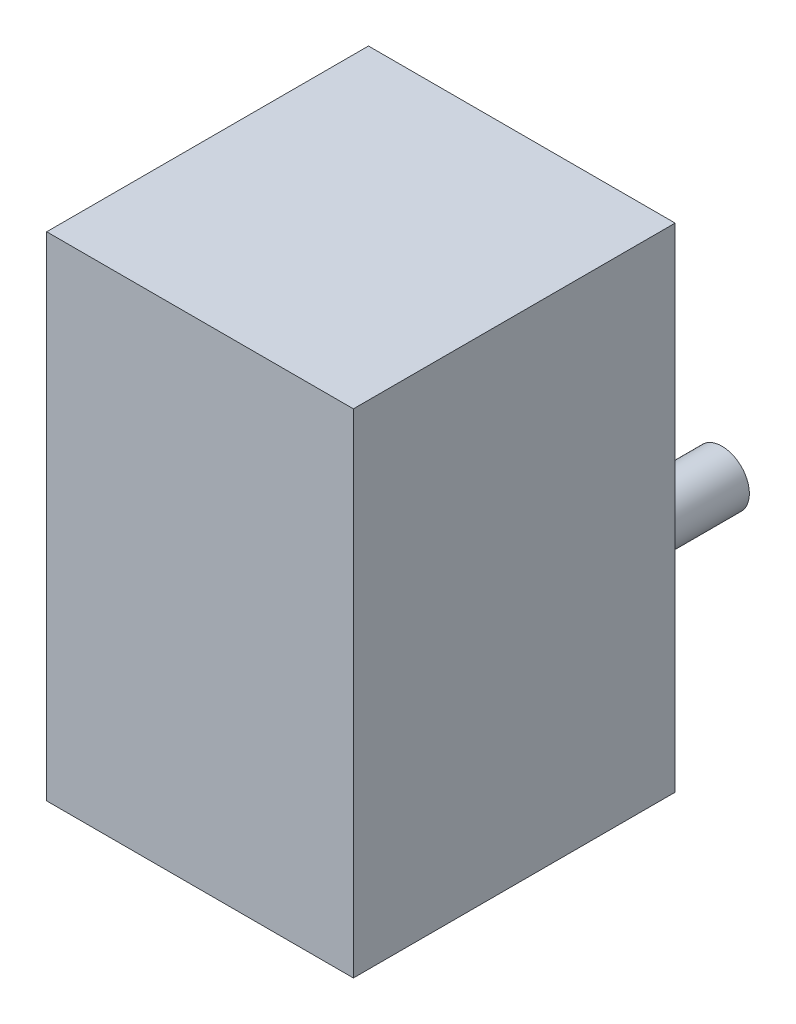
ISO-10303-21;
HEADER;
FILE_DESCRIPTION(('STEP AP214'),'2;1');
FILE_NAME('part.step','',(''),(''),'','','');
FILE_SCHEMA(('AUTOMOTIVE_DESIGN { 1 0 10303 214 1 1 1 1 }'));
ENDSEC;
DATA;
#1=APPLICATION_CONTEXT('core data for automotive mechanical design processes');
#2=APPLICATION_PROTOCOL_DEFINITION('international standard','automotive_design',2000,#1);
#3=PRODUCT_CONTEXT('',#1,'mechanical');
#4=PRODUCT('Part','Part','',(#3));
#5=PRODUCT_RELATED_PRODUCT_CATEGORY('part','',(#4));
#6=PRODUCT_DEFINITION_FORMATION('','',#4);
#7=PRODUCT_DEFINITION_CONTEXT('part definition',#1,'design');
#8=PRODUCT_DEFINITION('design','',#6,#7);
#9=PRODUCT_DEFINITION_SHAPE('','',#8);
#10=(LENGTH_UNIT() NAMED_UNIT(*) SI_UNIT(.MILLI.,.METRE.));
#11=(NAMED_UNIT(*) PLANE_ANGLE_UNIT() SI_UNIT($,.RADIAN.));
#12=(NAMED_UNIT(*) SI_UNIT($,.STERADIAN.) SOLID_ANGLE_UNIT());
#13=UNCERTAINTY_MEASURE_WITH_UNIT(LENGTH_MEASURE(1.E-05),#10,'distance_accuracy_value','');
#14=(GEOMETRIC_REPRESENTATION_CONTEXT(3) GLOBAL_UNCERTAINTY_ASSIGNED_CONTEXT((#13)) GLOBAL_UNIT_ASSIGNED_CONTEXT((#10,
#11,#12)) REPRESENTATION_CONTEXT('',''));
#15=CARTESIAN_POINT('',(0.,0.,0.));
#16=DIRECTION('',(0.,0.,1.));
#17=DIRECTION('',(1.,0.,0.));
#18=AXIS2_PLACEMENT_3D('',#15,#16,#17);
#19=CARTESIAN_POINT('',(-3.4,0.,3.375));
#20=DIRECTION('',(-1.,0.,0.));
#21=DIRECTION('',(0.,0.,1.));
#22=AXIS2_PLACEMENT_3D('',#19,#20,#21);
#23=PLANE('',#22);
#24=DIRECTION('',(0.,1.,0.));
#25=VECTOR('',#24,1.);
#26=CARTESIAN_POINT('',(-3.4,0.,3.375));
#27=LINE('',#26,#25);
#28=CARTESIAN_POINT('',(-3.4,8.,3.375));
#29=VERTEX_POINT('',#28);
#30=CARTESIAN_POINT('',(-3.4,0.,3.375));
#31=VERTEX_POINT('',#30);
#32=EDGE_CURVE('E192',#29,#31,#27,.F.);
#33=ORIENTED_EDGE('',*,*,#32,.T.);
#34=DIRECTION('',(0.,0.,1.));
#35=VECTOR('',#34,1.);
#36=CARTESIAN_POINT('',(-3.4,0.,3.375));
#37=LINE('',#36,#35);
#38=CARTESIAN_POINT('',(-3.4,0.,1.875));
#39=VERTEX_POINT('',#38);
#40=EDGE_CURVE('E177',#39,#31,#37,.T.);
#41=ORIENTED_EDGE('',*,*,#40,.F.);
#42=DIRECTION('',(0.,1.,0.));
#43=VECTOR('',#42,1.);
#44=CARTESIAN_POINT('',(-3.4,0.,1.875));
#45=LINE('',#44,#43);
#46=CARTESIAN_POINT('',(-3.4,8.,1.875));
#47=VERTEX_POINT('',#46);
#48=EDGE_CURVE('E288',#39,#47,#45,.T.);
#49=ORIENTED_EDGE('',*,*,#48,.T.);
#50=DIRECTION('',(0.,0.,1.));
#51=VECTOR('',#50,1.);
#52=CARTESIAN_POINT('',(-3.4,8.,3.375));
#53=LINE('',#52,#51);
#54=EDGE_CURVE('E189',#29,#47,#53,.F.);
#55=ORIENTED_EDGE('',*,*,#54,.F.);
#56=EDGE_LOOP('',(#33,#41,#49,#55));
#57=FACE_BOUND('',#56,.T.);
#58=ADVANCED_FACE('F16',(#57),#23,.F.);
#59=CARTESIAN_POINT('',(-4.5,0.,-0.975));
#60=DIRECTION('',(-1.,0.,0.));
#61=DIRECTION('',(0.,0.,1.));
#62=AXIS2_PLACEMENT_3D('',#59,#60,#61);
#63=PLANE('',#62);
#64=DIRECTION('',(0.,1.,0.));
#65=VECTOR('',#64,1.);
#66=CARTESIAN_POINT('',(-4.5,0.,-0.975));
#67=LINE('',#66,#65);
#68=CARTESIAN_POINT('',(-4.5,8.,-0.975));
#69=VERTEX_POINT('',#68);
#70=CARTESIAN_POINT('',(-4.5,0.,-0.975));
#71=VERTEX_POINT('',#70);
#72=EDGE_CURVE('E201',#69,#71,#67,.F.);
#73=ORIENTED_EDGE('',*,*,#72,.T.);
#74=DIRECTION('',(0.,0.,1.));
#75=VECTOR('',#74,1.);
#76=CARTESIAN_POINT('',(-4.5,0.,-0.975));
#77=LINE('',#76,#75);
#78=CARTESIAN_POINT('',(-4.5,0.,-2.6));
#79=VERTEX_POINT('',#78);
#80=EDGE_CURVE('E173',#79,#71,#77,.T.);
#81=ORIENTED_EDGE('',*,*,#80,.F.);
#82=DIRECTION('',(0.,1.,0.));
#83=VECTOR('',#82,1.);
#84=CARTESIAN_POINT('',(-4.5,0.,-2.6));
#85=LINE('',#84,#83);
#86=CARTESIAN_POINT('',(-4.5,8.,-2.6));
#87=VERTEX_POINT('',#86);
#88=EDGE_CURVE('E283',#79,#87,#85,.T.);
#89=ORIENTED_EDGE('',*,*,#88,.T.);
#90=DIRECTION('',(0.,0.,1.));
#91=VECTOR('',#90,1.);
#92=CARTESIAN_POINT('',(-4.5,8.,-0.975));
#93=LINE('',#92,#91);
#94=EDGE_CURVE('E214',#69,#87,#93,.F.);
#95=ORIENTED_EDGE('',*,*,#94,.F.);
#96=EDGE_LOOP('',(#73,#81,#89,#95));
#97=FACE_BOUND('',#96,.T.);
#98=ADVANCED_FACE('F407',(#97),#63,.F.);
#99=CARTESIAN_POINT('',(4.5,0.,-2.6));
#100=DIRECTION('',(1.,0.,0.));
#101=DIRECTION('',(0.,0.,-1.));
#102=AXIS2_PLACEMENT_3D('',#99,#100,#101);
#103=PLANE('',#102);
#104=DIRECTION('',(0.,1.,0.));
#105=VECTOR('',#104,1.);
#106=CARTESIAN_POINT('',(4.5,0.,-2.6));
#107=LINE('',#106,#105);
#108=CARTESIAN_POINT('',(4.5,8.,-2.6));
#109=VERTEX_POINT('',#108);
#110=CARTESIAN_POINT('',(4.5,0.,-2.6));
#111=VERTEX_POINT('',#110);
#112=EDGE_CURVE('E280',#109,#111,#107,.F.);
#113=ORIENTED_EDGE('',*,*,#112,.T.);
#114=DIRECTION('',(0.,0.,-1.));
#115=VECTOR('',#114,1.);
#116=CARTESIAN_POINT('',(4.5,0.,-2.6));
#117=LINE('',#116,#115);
#118=CARTESIAN_POINT('',(4.5,0.,-0.975));
#119=VERTEX_POINT('',#118);
#120=EDGE_CURVE('E212',#119,#111,#117,.T.);
#121=ORIENTED_EDGE('',*,*,#120,.F.);
#122=DIRECTION('',(0.,1.,0.));
#123=VECTOR('',#122,1.);
#124=CARTESIAN_POINT('',(4.5,0.,-0.975));
#125=LINE('',#124,#123);
#126=CARTESIAN_POINT('',(4.5,8.,-0.975));
#127=VERTEX_POINT('',#126);
#128=EDGE_CURVE('E268',#119,#127,#125,.T.);
#129=ORIENTED_EDGE('',*,*,#128,.T.);
#130=DIRECTION('',(0.,0.,-1.));
#131=VECTOR('',#130,1.);
#132=CARTESIAN_POINT('',(4.5,8.,-2.6));
#133=LINE('',#132,#131);
#134=EDGE_CURVE('E210',#109,#127,#133,.F.);
#135=ORIENTED_EDGE('',*,*,#134,.F.);
#136=EDGE_LOOP('',(#113,#121,#129,#135));
#137=FACE_BOUND('',#136,.T.);
#138=ADVANCED_FACE('F498',(#137),#103,.F.);
#139=CARTESIAN_POINT('',(3.4,0.,1.875));
#140=DIRECTION('',(1.,0.,0.));
#141=DIRECTION('',(0.,0.,-1.));
#142=AXIS2_PLACEMENT_3D('',#139,#140,#141);
#143=PLANE('',#142);
#144=DIRECTION('',(0.,1.,0.));
#145=VECTOR('',#144,1.);
#146=CARTESIAN_POINT('',(3.4,0.,1.875));
#147=LINE('',#146,#145);
#148=CARTESIAN_POINT('',(3.4,8.,1.875));
#149=VERTEX_POINT('',#148);
#150=CARTESIAN_POINT('',(3.4,0.,1.875));
#151=VERTEX_POINT('',#150);
#152=EDGE_CURVE('E275',#149,#151,#147,.F.);
#153=ORIENTED_EDGE('',*,*,#152,.T.);
#154=DIRECTION('',(0.,0.,-1.));
#155=VECTOR('',#154,1.);
#156=CARTESIAN_POINT('',(3.4,0.,1.875));
#157=LINE('',#156,#155);
#158=CARTESIAN_POINT('',(3.4,0.,3.375));
#159=VERTEX_POINT('',#158);
#160=EDGE_CURVE('E208',#159,#151,#157,.T.);
#161=ORIENTED_EDGE('',*,*,#160,.F.);
#162=DIRECTION('',(0.,1.,0.));
#163=VECTOR('',#162,1.);
#164=CARTESIAN_POINT('',(3.4,0.,3.375));
#165=LINE('',#164,#163);
#166=CARTESIAN_POINT('',(3.4,8.,3.375));
#167=VERTEX_POINT('',#166);
#168=EDGE_CURVE('E263',#159,#167,#165,.T.);
#169=ORIENTED_EDGE('',*,*,#168,.T.);
#170=DIRECTION('',(0.,0.,-1.));
#171=VECTOR('',#170,1.);
#172=CARTESIAN_POINT('',(3.4,8.,1.875));
#173=LINE('',#172,#171);
#174=EDGE_CURVE('E195',#149,#167,#173,.F.);
#175=ORIENTED_EDGE('',*,*,#174,.F.);
#176=EDGE_LOOP('',(#153,#161,#169,#175));
#177=FACE_BOUND('',#176,.T.);
#178=ADVANCED_FACE('F494',(#177),#143,.F.);
#179=CARTESIAN_POINT('',(0.,0.,-9.375));
#180=DIRECTION('',(0.,0.,-1.));
#181=DIRECTION('',(-1.,0.,0.));
#182=AXIS2_PLACEMENT_3D('',#179,#180,#181);
#183=PLANE('',#182);
#184=CARTESIAN_POINT('',(3.81,7.3,-9.375));
#185=DIRECTION('',(0.,0.,-1.));
#186=DIRECTION('',(-1.,0.,0.));
#187=AXIS2_PLACEMENT_3D('',#184,#185,#186);
#188=CIRCLE('',#187,1.);
#189=CARTESIAN_POINT('',(2.81,7.3,-9.375));
#190=VERTEX_POINT('',#189);
#191=EDGE_CURVE('E19',#190,#190,#188,.F.);
#192=ORIENTED_EDGE('',*,*,#191,.F.);
#193=EDGE_LOOP('',(#192));
#194=FACE_BOUND('',#193,.T.);
#195=ADVANCED_FACE('F505',(#194),#183,.T.);
#196=CARTESIAN_POINT('',(0.,0.,-9.375));
#197=DIRECTION('',(0.,0.,-1.));
#198=DIRECTION('',(-1.,0.,0.));
#199=AXIS2_PLACEMENT_3D('',#196,#197,#198);
#200=PLANE('',#199);
#201=CARTESIAN_POINT('',(-3.81,7.3,-9.375));
#202=DIRECTION('',(0.,0.,-1.));
#203=DIRECTION('',(-1.,0.,0.));
#204=AXIS2_PLACEMENT_3D('',#201,#202,#203);
#205=CIRCLE('',#204,1.);
#206=CARTESIAN_POINT('',(-4.81,7.3,-9.375));
#207=VERTEX_POINT('',#206);
#208=EDGE_CURVE('E225',#207,#207,#205,.F.);
#209=ORIENTED_EDGE('',*,*,#208,.F.);
#210=EDGE_LOOP('',(#209));
#211=FACE_BOUND('',#210,.T.);
#212=ADVANCED_FACE('F510',(#211),#200,.T.);
#213=CARTESIAN_POINT('',(-2.1,0.,3.375));
#214=DIRECTION('',(0.,0.,1.));
#215=DIRECTION('',(1.,0.,0.));
#216=AXIS2_PLACEMENT_3D('',#213,#214,#215);
#217=PLANE('',#216);
#218=DIRECTION('',(0.,1.,0.));
#219=VECTOR('',#218,1.);
#220=CARTESIAN_POINT('',(-2.1,0.,3.375));
#221=LINE('',#220,#219);
#222=CARTESIAN_POINT('',(-2.1,8.,3.375));
#223=VERTEX_POINT('',#222);
#224=CARTESIAN_POINT('',(-2.1,0.,3.375));
#225=VERTEX_POINT('',#224);
#226=EDGE_CURVE('E199',#223,#225,#221,.F.);
#227=ORIENTED_EDGE('',*,*,#226,.T.);
#228=DIRECTION('',(1.,0.,0.));
#229=VECTOR('',#228,1.);
#230=CARTESIAN_POINT('',(-2.1,0.,3.375));
#231=LINE('',#230,#229);
#232=EDGE_CURVE('E182',#31,#225,#231,.T.);
#233=ORIENTED_EDGE('',*,*,#232,.F.);
#234=ORIENTED_EDGE('',*,*,#32,.F.);
#235=DIRECTION('',(1.,0.,0.));
#236=VECTOR('',#235,1.);
#237=CARTESIAN_POINT('',(0.,8.,3.375));
#238=LINE('',#237,#236);
#239=EDGE_CURVE('E261',#223,#29,#238,.F.);
#240=ORIENTED_EDGE('',*,*,#239,.F.);
#241=EDGE_LOOP('',(#227,#233,#234,#240));
#242=FACE_BOUND('',#241,.T.);
#243=ADVANCED_FACE('F197',(#242),#217,.F.);
#244=CARTESIAN_POINT('',(-3.925,0.,-0.975));
#245=DIRECTION('',(0.,0.,1.));
#246=DIRECTION('',(1.,0.,0.));
#247=AXIS2_PLACEMENT_3D('',#244,#245,#246);
#248=PLANE('',#247);
#249=DIRECTION('',(0.,1.,0.));
#250=VECTOR('',#249,1.);
#251=CARTESIAN_POINT('',(-3.925,0.,-0.975));
#252=LINE('',#251,#250);
#253=CARTESIAN_POINT('',(-3.925,8.,-0.975));
#254=VERTEX_POINT('',#253);
#255=CARTESIAN_POINT('',(-3.925,0.,-0.975));
#256=VERTEX_POINT('',#255);
#257=EDGE_CURVE('E297',#254,#256,#252,.F.);
#258=ORIENTED_EDGE('',*,*,#257,.T.);
#259=DIRECTION('',(1.,0.,0.));
#260=VECTOR('',#259,1.);
#261=CARTESIAN_POINT('',(-3.925,0.,-0.975));
#262=LINE('',#261,#260);
#263=EDGE_CURVE('E203',#71,#256,#262,.T.);
#264=ORIENTED_EDGE('',*,*,#263,.F.);
#265=ORIENTED_EDGE('',*,*,#72,.F.);
#266=DIRECTION('',(1.,0.,0.));
#267=VECTOR('',#266,1.);
#268=CARTESIAN_POINT('',(0.,8.,-0.975));
#269=LINE('',#268,#267);
#270=EDGE_CURVE('E255',#254,#69,#269,.F.);
#271=ORIENTED_EDGE('',*,*,#270,.F.);
#272=EDGE_LOOP('',(#258,#264,#265,#271));
#273=FACE_BOUND('',#272,.T.);
#274=ADVANCED_FACE('F298',(#273),#248,.F.);
#275=CARTESIAN_POINT('',(-3.4,0.,1.875));
#276=DIRECTION('',(0.,0.,1.));
#277=DIRECTION('',(1.,0.,0.));
#278=AXIS2_PLACEMENT_3D('',#275,#276,#277);
#279=PLANE('',#278);
#280=ORIENTED_EDGE('',*,*,#48,.F.);
#281=DIRECTION('',(1.,0.,0.));
#282=VECTOR('',#281,1.);
#283=CARTESIAN_POINT('',(-3.4,0.,1.875));
#284=LINE('',#283,#282);
#285=CARTESIAN_POINT('',(-3.925,0.,1.875));
#286=VERTEX_POINT('',#285);
#287=EDGE_CURVE('E185',#286,#39,#284,.T.);
#288=ORIENTED_EDGE('',*,*,#287,.F.);
#289=DIRECTION('',(0.,1.,0.));
#290=VECTOR('',#289,1.);
#291=CARTESIAN_POINT('',(-3.925,0.,1.875));
#292=LINE('',#291,#290);
#293=CARTESIAN_POINT('',(-3.925,8.,1.875));
#294=VERTEX_POINT('',#293);
#295=EDGE_CURVE('E302',#286,#294,#292,.T.);
#296=ORIENTED_EDGE('',*,*,#295,.T.);
#297=DIRECTION('',(1.,0.,0.));
#298=VECTOR('',#297,1.);
#299=CARTESIAN_POINT('',(0.,8.,1.875));
#300=LINE('',#299,#298);
#301=EDGE_CURVE('E258',#47,#294,#300,.F.);
#302=ORIENTED_EDGE('',*,*,#301,.F.);
#303=EDGE_LOOP('',(#280,#288,#296,#302));
#304=FACE_BOUND('',#303,.T.);
#305=ADVANCED_FACE('F410',(#304),#279,.F.);
#306=CARTESIAN_POINT('',(-4.5,0.,-2.6));
#307=DIRECTION('',(0.,0.,-1.));
#308=DIRECTION('',(-1.,0.,0.));
#309=AXIS2_PLACEMENT_3D('',#306,#307,#308);
#310=PLANE('',#309);
#311=ORIENTED_EDGE('',*,*,#88,.F.);
#312=DIRECTION('',(-1.,0.,0.));
#313=VECTOR('',#312,1.);
#314=CARTESIAN_POINT('',(-4.5,0.,-2.6));
#315=LINE('',#314,#313);
#316=CARTESIAN_POINT('',(-3.925,0.,-2.6));
#317=VERTEX_POINT('',#316);
#318=EDGE_CURVE('E286',#317,#79,#315,.T.);
#319=ORIENTED_EDGE('',*,*,#318,.F.);
#320=DIRECTION('',(0.,1.,0.));
#321=VECTOR('',#320,1.);
#322=CARTESIAN_POINT('',(-3.925,0.,-2.6));
#323=LINE('',#322,#321);
#324=CARTESIAN_POINT('',(-3.925,8.,-2.6));
#325=VERTEX_POINT('',#324);
#326=EDGE_CURVE('E347',#317,#325,#323,.T.);
#327=ORIENTED_EDGE('',*,*,#326,.T.);
#328=DIRECTION('',(1.,0.,0.));
#329=VECTOR('',#328,1.);
#330=CARTESIAN_POINT('',(0.,8.,-2.6));
#331=LINE('',#330,#329);
#332=EDGE_CURVE('E252',#87,#325,#331,.T.);
#333=ORIENTED_EDGE('',*,*,#332,.F.);
#334=EDGE_LOOP('',(#311,#319,#327,#333));
#335=FACE_BOUND('',#334,.T.);
#336=ADVANCED_FACE('F408',(#335),#310,.F.);
#337=CARTESIAN_POINT('',(3.925,0.,-2.6));
#338=DIRECTION('',(0.,0.,-1.));
#339=DIRECTION('',(-1.,0.,0.));
#340=AXIS2_PLACEMENT_3D('',#337,#338,#339);
#341=PLANE('',#340);
#342=DIRECTION('',(0.,1.,0.));
#343=VECTOR('',#342,1.);
#344=CARTESIAN_POINT('',(3.925,0.,-2.6));
#345=LINE('',#344,#343);
#346=CARTESIAN_POINT('',(3.925,8.,-2.6));
#347=VERTEX_POINT('',#346);
#348=CARTESIAN_POINT('',(3.925,0.,-2.6));
#349=VERTEX_POINT('',#348);
#350=EDGE_CURVE('E337',#347,#349,#345,.F.);
#351=ORIENTED_EDGE('',*,*,#350,.T.);
#352=DIRECTION('',(-1.,0.,0.));
#353=VECTOR('',#352,1.);
#354=CARTESIAN_POINT('',(3.925,0.,-2.6));
#355=LINE('',#354,#353);
#356=EDGE_CURVE('E278',#111,#349,#355,.T.);
#357=ORIENTED_EDGE('',*,*,#356,.F.);
#358=ORIENTED_EDGE('',*,*,#112,.F.);
#359=DIRECTION('',(1.,0.,0.));
#360=VECTOR('',#359,1.);
#361=CARTESIAN_POINT('',(0.,8.,-2.6));
#362=LINE('',#361,#360);
#363=EDGE_CURVE('E249',#347,#109,#362,.T.);
#364=ORIENTED_EDGE('',*,*,#363,.F.);
#365=EDGE_LOOP('',(#351,#357,#358,#364));
#366=FACE_BOUND('',#365,.T.);
#367=ADVANCED_FACE('F398',(#366),#341,.F.);
#368=CARTESIAN_POINT('',(3.925,0.,1.875));
#369=DIRECTION('',(0.,0.,1.));
#370=DIRECTION('',(1.,0.,0.));
#371=AXIS2_PLACEMENT_3D('',#368,#369,#370);
#372=PLANE('',#371);
#373=DIRECTION('',(0.,1.,0.));
#374=VECTOR('',#373,1.);
#375=CARTESIAN_POINT('',(3.925,0.,1.875));
#376=LINE('',#375,#374);
#377=CARTESIAN_POINT('',(3.925,8.,1.875));
#378=VERTEX_POINT('',#377);
#379=CARTESIAN_POINT('',(3.925,0.,1.875));
#380=VERTEX_POINT('',#379);
#381=EDGE_CURVE('E328',#378,#380,#376,.F.);
#382=ORIENTED_EDGE('',*,*,#381,.T.);
#383=DIRECTION('',(1.,0.,0.));
#384=VECTOR('',#383,1.);
#385=CARTESIAN_POINT('',(3.925,0.,1.875));
#386=LINE('',#385,#384);
#387=EDGE_CURVE('E273',#151,#380,#386,.T.);
#388=ORIENTED_EDGE('',*,*,#387,.F.);
#389=ORIENTED_EDGE('',*,*,#152,.F.);
#390=DIRECTION('',(1.,0.,0.));
#391=VECTOR('',#390,1.);
#392=CARTESIAN_POINT('',(0.,8.,1.875));
#393=LINE('',#392,#391);
#394=EDGE_CURVE('E236',#378,#149,#393,.F.);
#395=ORIENTED_EDGE('',*,*,#394,.F.);
#396=EDGE_LOOP('',(#382,#388,#389,#395));
#397=FACE_BOUND('',#396,.T.);
#398=ADVANCED_FACE('F417',(#397),#372,.F.);
#399=CARTESIAN_POINT('',(4.5,0.,-0.975));
#400=DIRECTION('',(0.,0.,1.));
#401=DIRECTION('',(1.,0.,0.));
#402=AXIS2_PLACEMENT_3D('',#399,#400,#401);
#403=PLANE('',#402);
#404=ORIENTED_EDGE('',*,*,#128,.F.);
#405=DIRECTION('',(1.,0.,0.));
#406=VECTOR('',#405,1.);
#407=CARTESIAN_POINT('',(4.5,0.,-0.975));
#408=LINE('',#407,#406);
#409=CARTESIAN_POINT('',(3.925,0.,-0.975));
#410=VERTEX_POINT('',#409);
#411=EDGE_CURVE('E271',#410,#119,#408,.T.);
#412=ORIENTED_EDGE('',*,*,#411,.F.);
#413=DIRECTION('',(0.,1.,0.));
#414=VECTOR('',#413,1.);
#415=CARTESIAN_POINT('',(3.925,0.,-0.975));
#416=LINE('',#415,#414);
#417=CARTESIAN_POINT('',(3.925,8.,-0.975));
#418=VERTEX_POINT('',#417);
#419=EDGE_CURVE('E326',#410,#418,#416,.T.);
#420=ORIENTED_EDGE('',*,*,#419,.T.);
#421=DIRECTION('',(1.,0.,0.));
#422=VECTOR('',#421,1.);
#423=CARTESIAN_POINT('',(0.,8.,-0.975));
#424=LINE('',#423,#422);
#425=EDGE_CURVE('E243',#127,#418,#424,.F.);
#426=ORIENTED_EDGE('',*,*,#425,.F.);
#427=EDGE_LOOP('',(#404,#412,#420,#426));
#428=FACE_BOUND('',#427,.T.);
#429=ADVANCED_FACE('F476',(#428),#403,.F.);
#430=CARTESIAN_POINT('',(3.4,0.,3.375));
#431=DIRECTION('',(0.,0.,1.));
#432=DIRECTION('',(1.,0.,0.));
#433=AXIS2_PLACEMENT_3D('',#430,#431,#432);
#434=PLANE('',#433);
#435=ORIENTED_EDGE('',*,*,#168,.F.);
#436=DIRECTION('',(1.,0.,0.));
#437=VECTOR('',#436,1.);
#438=CARTESIAN_POINT('',(3.4,0.,3.375));
#439=LINE('',#438,#437);
#440=CARTESIAN_POINT('',(2.1,0.,3.375));
#441=VERTEX_POINT('',#440);
#442=EDGE_CURVE('E266',#441,#159,#439,.T.);
#443=ORIENTED_EDGE('',*,*,#442,.F.);
#444=DIRECTION('',(0.,1.,0.));
#445=VECTOR('',#444,1.);
#446=CARTESIAN_POINT('',(2.1,0.,3.375));
#447=LINE('',#446,#445);
#448=CARTESIAN_POINT('',(2.1,8.,3.375));
#449=VERTEX_POINT('',#448);
#450=EDGE_CURVE('E319',#441,#449,#447,.T.);
#451=ORIENTED_EDGE('',*,*,#450,.T.);
#452=DIRECTION('',(1.,0.,0.));
#453=VECTOR('',#452,1.);
#454=CARTESIAN_POINT('',(0.,8.,3.375));
#455=LINE('',#454,#453);
#456=EDGE_CURVE('E232',#167,#449,#455,.F.);
#457=ORIENTED_EDGE('',*,*,#456,.F.);
#458=EDGE_LOOP('',(#435,#443,#451,#457));
#459=FACE_BOUND('',#458,.T.);
#460=ADVANCED_FACE('F473',(#459),#434,.F.);
#461=CARTESIAN_POINT('',(0.,8.,0.));
#462=DIRECTION('',(0.,-1.,0.));
#463=DIRECTION('',(0.,0.,-1.));
#464=AXIS2_PLACEMENT_3D('',#461,#462,#463);
#465=PLANE('',#464);
#466=ORIENTED_EDGE('',*,*,#456,.T.);
#467=DIRECTION('',(0.,0.,-1.));
#468=VECTOR('',#467,1.);
#469=CARTESIAN_POINT('',(2.1,8.,3.375));
#470=LINE('',#469,#468);
#471=CARTESIAN_POINT('',(2.1,8.,5.375));
#472=VERTEX_POINT('',#471);
#473=EDGE_CURVE('E224',#449,#472,#470,.F.);
#474=ORIENTED_EDGE('',*,*,#473,.T.);
#475=DIRECTION('',(1.,0.,0.));
#476=VECTOR('',#475,1.);
#477=CARTESIAN_POINT('',(2.1,8.,5.375));
#478=LINE('',#477,#476);
#479=CARTESIAN_POINT('',(-2.1,8.,5.375));
#480=VERTEX_POINT('',#479);
#481=EDGE_CURVE('E227',#472,#480,#478,.F.);
#482=ORIENTED_EDGE('',*,*,#481,.T.);
#483=DIRECTION('',(0.,0.,1.));
#484=VECTOR('',#483,1.);
#485=CARTESIAN_POINT('',(-2.1,8.,5.375));
#486=LINE('',#485,#484);
#487=EDGE_CURVE('E303',#480,#223,#486,.F.);
#488=ORIENTED_EDGE('',*,*,#487,.T.);
#489=ORIENTED_EDGE('',*,*,#239,.T.);
#490=ORIENTED_EDGE('',*,*,#54,.T.);
#491=ORIENTED_EDGE('',*,*,#301,.T.);
#492=DIRECTION('',(0.,0.,1.));
#493=VECTOR('',#492,1.);
#494=CARTESIAN_POINT('',(-3.925,8.,1.875));
#495=LINE('',#494,#493);
#496=EDGE_CURVE('E349',#294,#254,#495,.F.);
#497=ORIENTED_EDGE('',*,*,#496,.T.);
#498=ORIENTED_EDGE('',*,*,#270,.T.);
#499=ORIENTED_EDGE('',*,*,#94,.T.);
#500=ORIENTED_EDGE('',*,*,#332,.T.);
#501=DIRECTION('',(0.,0.,1.));
#502=VECTOR('',#501,1.);
#503=CARTESIAN_POINT('',(-3.925,8.,-2.6));
#504=LINE('',#503,#502);
#505=CARTESIAN_POINT('',(-3.925,8.,-5.555));
#506=VERTEX_POINT('',#505);
#507=EDGE_CURVE('E345',#325,#506,#504,.F.);
#508=ORIENTED_EDGE('',*,*,#507,.T.);
#509=DIRECTION('',(-1.,0.,0.));
#510=VECTOR('',#509,1.);
#511=CARTESIAN_POINT('',(-3.925,8.,-5.555));
#512=LINE('',#511,#510);
#513=CARTESIAN_POINT('',(3.925,8.,-5.555));
#514=VERTEX_POINT('',#513);
#515=EDGE_CURVE('E340',#506,#514,#512,.F.);
#516=ORIENTED_EDGE('',*,*,#515,.T.);
#517=DIRECTION('',(0.,0.,-1.));
#518=VECTOR('',#517,1.);
#519=CARTESIAN_POINT('',(3.925,8.,-5.555));
#520=LINE('',#519,#518);
#521=EDGE_CURVE('E331',#514,#347,#520,.F.);
#522=ORIENTED_EDGE('',*,*,#521,.T.);
#523=ORIENTED_EDGE('',*,*,#363,.T.);
#524=ORIENTED_EDGE('',*,*,#134,.T.);
#525=ORIENTED_EDGE('',*,*,#425,.T.);
#526=DIRECTION('',(0.,0.,-1.));
#527=VECTOR('',#526,1.);
#528=CARTESIAN_POINT('',(3.925,8.,-0.975));
#529=LINE('',#528,#527);
#530=EDGE_CURVE('E323',#418,#378,#529,.F.);
#531=ORIENTED_EDGE('',*,*,#530,.T.);
#532=ORIENTED_EDGE('',*,*,#394,.T.);
#533=ORIENTED_EDGE('',*,*,#174,.T.);
#534=EDGE_LOOP('',(#466,#474,#482,#488,#489,#490,#491,#497,#498,#499,#500,#508,#516,#522,#523,
#524,#525,#531,#532,#533));
#535=FACE_BOUND('',#534,.T.);
#536=ADVANCED_FACE('F363',(#535),#465,.T.);
#537=CARTESIAN_POINT('',(3.81,7.3,-5.875));
#538=DIRECTION('',(0.,0.,-1.));
#539=DIRECTION('',(-1.,0.,0.));
#540=AXIS2_PLACEMENT_3D('',#537,#538,#539);
#541=CYLINDRICAL_SURFACE('',#540,1.);
#542=ORIENTED_EDGE('',*,*,#191,.T.);
#543=EDGE_LOOP('',(#542));
#544=FACE_BOUND('',#543,.T.);
#545=CARTESIAN_POINT('',(3.81,7.3,-5.875));
#546=DIRECTION('',(0.,0.,-1.));
#547=DIRECTION('',(-1.,0.,0.));
#548=AXIS2_PLACEMENT_3D('',#545,#546,#547);
#549=CIRCLE('',#548,1.);
#550=CARTESIAN_POINT('',(2.81,7.3,-5.875));
#551=VERTEX_POINT('',#550);
#552=EDGE_CURVE('E222',#551,#551,#549,.F.);
#553=ORIENTED_EDGE('',*,*,#552,.F.);
#554=EDGE_LOOP('',(#553));
#555=FACE_BOUND('',#554,.T.);
#556=ADVANCED_FACE('F468',(#544,#555),#541,.T.);
#557=CARTESIAN_POINT('',(-3.81,7.3,-5.875));
#558=DIRECTION('',(0.,0.,-1.));
#559=DIRECTION('',(-1.,0.,0.));
#560=AXIS2_PLACEMENT_3D('',#557,#558,#559);
#561=CYLINDRICAL_SURFACE('',#560,1.);
#562=ORIENTED_EDGE('',*,*,#208,.T.);
#563=EDGE_LOOP('',(#562));
#564=FACE_BOUND('',#563,.T.);
#565=CARTESIAN_POINT('',(-3.81,7.3,-5.875));
#566=DIRECTION('',(0.,0.,-1.));
#567=DIRECTION('',(-1.,0.,0.));
#568=AXIS2_PLACEMENT_3D('',#565,#566,#567);
#569=CIRCLE('',#568,1.);
#570=CARTESIAN_POINT('',(-4.81,7.3,-5.875));
#571=VERTEX_POINT('',#570);
#572=EDGE_CURVE('E218',#571,#571,#569,.F.);
#573=ORIENTED_EDGE('',*,*,#572,.F.);
#574=EDGE_LOOP('',(#573));
#575=FACE_BOUND('',#574,.T.);
#576=ADVANCED_FACE('F465',(#564,#575),#561,.T.);
#577=CARTESIAN_POINT('',(2.1,0.,5.375));
#578=DIRECTION('',(0.,0.,1.));
#579=DIRECTION('',(1.,0.,0.));
#580=AXIS2_PLACEMENT_3D('',#577,#578,#579);
#581=PLANE('',#580);
#582=DIRECTION('',(0.,1.,0.));
#583=VECTOR('',#582,1.);
#584=CARTESIAN_POINT('',(2.1,0.,5.375));
#585=LINE('',#584,#583);
#586=CARTESIAN_POINT('',(2.1,0.,5.375));
#587=VERTEX_POINT('',#586);
#588=EDGE_CURVE('E321',#472,#587,#585,.F.);
#589=ORIENTED_EDGE('',*,*,#588,.T.);
#590=DIRECTION('',(1.,0.,0.));
#591=VECTOR('',#590,1.);
#592=CARTESIAN_POINT('',(0.,0.,5.375));
#593=LINE('',#592,#591);
#594=CARTESIAN_POINT('',(-2.1,0.,5.375));
#595=VERTEX_POINT('',#594);
#596=EDGE_CURVE('E312',#587,#595,#593,.F.);
#597=ORIENTED_EDGE('',*,*,#596,.T.);
#598=DIRECTION('',(0.,1.,0.));
#599=VECTOR('',#598,1.);
#600=CARTESIAN_POINT('',(-2.1,0.,5.375));
#601=LINE('',#600,#599);
#602=EDGE_CURVE('E354',#595,#480,#601,.T.);
#603=ORIENTED_EDGE('',*,*,#602,.T.);
#604=ORIENTED_EDGE('',*,*,#481,.F.);
#605=EDGE_LOOP('',(#589,#597,#603,#604));
#606=FACE_BOUND('',#605,.T.);
#607=ADVANCED_FACE('F359',(#606),#581,.F.);
#608=CARTESIAN_POINT('',(-2.1,0.,5.375));
#609=DIRECTION('',(-1.,0.,0.));
#610=DIRECTION('',(0.,0.,1.));
#611=AXIS2_PLACEMENT_3D('',#608,#609,#610);
#612=PLANE('',#611);
#613=ORIENTED_EDGE('',*,*,#602,.F.);
#614=DIRECTION('',(0.,0.,1.));
#615=VECTOR('',#614,1.);
#616=CARTESIAN_POINT('',(-2.1,0.,0.));
#617=LINE('',#616,#615);
#618=EDGE_CURVE('E308',#595,#225,#617,.F.);
#619=ORIENTED_EDGE('',*,*,#618,.T.);
#620=ORIENTED_EDGE('',*,*,#226,.F.);
#621=ORIENTED_EDGE('',*,*,#487,.F.);
#622=EDGE_LOOP('',(#613,#619,#620,#621));
#623=FACE_BOUND('',#622,.T.);
#624=ADVANCED_FACE('F362',(#623),#612,.F.);
#625=CARTESIAN_POINT('',(-3.925,0.,1.875));
#626=DIRECTION('',(-1.,0.,0.));
#627=DIRECTION('',(0.,0.,1.));
#628=AXIS2_PLACEMENT_3D('',#625,#626,#627);
#629=PLANE('',#628);
#630=ORIENTED_EDGE('',*,*,#295,.F.);
#631=DIRECTION('',(0.,0.,1.));
#632=VECTOR('',#631,1.);
#633=CARTESIAN_POINT('',(-3.925,0.,0.));
#634=LINE('',#633,#632);
#635=EDGE_CURVE('E293',#286,#256,#634,.F.);
#636=ORIENTED_EDGE('',*,*,#635,.T.);
#637=ORIENTED_EDGE('',*,*,#257,.F.);
#638=ORIENTED_EDGE('',*,*,#496,.F.);
#639=EDGE_LOOP('',(#630,#636,#637,#638));
#640=FACE_BOUND('',#639,.T.);
#641=ADVANCED_FACE('F306',(#640),#629,.F.);
#642=CARTESIAN_POINT('',(-3.925,0.,-2.6));
#643=DIRECTION('',(-1.,0.,0.));
#644=DIRECTION('',(0.,0.,1.));
#645=AXIS2_PLACEMENT_3D('',#642,#643,#644);
#646=PLANE('',#645);
#647=ORIENTED_EDGE('',*,*,#326,.F.);
#648=DIRECTION('',(0.,0.,1.));
#649=VECTOR('',#648,1.);
#650=CARTESIAN_POINT('',(-3.925,0.,0.));
#651=LINE('',#650,#649);
#652=CARTESIAN_POINT('',(-3.925,0.,-5.555));
#653=VERTEX_POINT('',#652);
#654=EDGE_CURVE('E307',#317,#653,#651,.F.);
#655=ORIENTED_EDGE('',*,*,#654,.T.);
#656=DIRECTION('',(0.,1.,0.));
#657=VECTOR('',#656,1.);
#658=CARTESIAN_POINT('',(-3.925,0.,-5.555));
#659=LINE('',#658,#657);
#660=EDGE_CURVE('E342',#653,#506,#659,.T.);
#661=ORIENTED_EDGE('',*,*,#660,.T.);
#662=ORIENTED_EDGE('',*,*,#507,.F.);
#663=EDGE_LOOP('',(#647,#655,#661,#662));
#664=FACE_BOUND('',#663,.T.);
#665=ADVANCED_FACE('F403',(#664),#646,.F.);
#666=CARTESIAN_POINT('',(-3.925,0.,-5.555));
#667=DIRECTION('',(0.,0.,-1.));
#668=DIRECTION('',(-1.,0.,0.));
#669=AXIS2_PLACEMENT_3D('',#666,#667,#668);
#670=PLANE('',#669);
#671=ORIENTED_EDGE('',*,*,#660,.F.);
#672=DIRECTION('',(1.,0.,0.));
#673=VECTOR('',#672,1.);
#674=CARTESIAN_POINT('',(0.,0.,-5.555));
#675=LINE('',#674,#673);
#676=CARTESIAN_POINT('',(3.925,0.,-5.555));
#677=VERTEX_POINT('',#676);
#678=EDGE_CURVE('E310',#653,#677,#675,.T.);
#679=ORIENTED_EDGE('',*,*,#678,.T.);
#680=DIRECTION('',(0.,1.,0.));
#681=VECTOR('',#680,1.);
#682=CARTESIAN_POINT('',(3.925,0.,-5.555));
#683=LINE('',#682,#681);
#684=EDGE_CURVE('E334',#677,#514,#683,.T.);
#685=ORIENTED_EDGE('',*,*,#684,.T.);
#686=ORIENTED_EDGE('',*,*,#515,.F.);
#687=EDGE_LOOP('',(#671,#679,#685,#686));
#688=FACE_BOUND('',#687,.T.);
#689=ADVANCED_FACE('F386',(#688),#670,.F.);
#690=CARTESIAN_POINT('',(3.925,0.,-5.555));
#691=DIRECTION('',(1.,0.,0.));
#692=DIRECTION('',(0.,0.,-1.));
#693=AXIS2_PLACEMENT_3D('',#690,#691,#692);
#694=PLANE('',#693);
#695=ORIENTED_EDGE('',*,*,#684,.F.);
#696=DIRECTION('',(0.,0.,1.));
#697=VECTOR('',#696,1.);
#698=CARTESIAN_POINT('',(3.925,0.,0.));
#699=LINE('',#698,#697);
#700=EDGE_CURVE('E377',#677,#349,#699,.T.);
#701=ORIENTED_EDGE('',*,*,#700,.T.);
#702=ORIENTED_EDGE('',*,*,#350,.F.);
#703=ORIENTED_EDGE('',*,*,#521,.F.);
#704=EDGE_LOOP('',(#695,#701,#702,#703));
#705=FACE_BOUND('',#704,.T.);
#706=ADVANCED_FACE('F392',(#705),#694,.F.);
#707=CARTESIAN_POINT('',(3.925,0.,-0.975));
#708=DIRECTION('',(1.,0.,0.));
#709=DIRECTION('',(0.,0.,-1.));
#710=AXIS2_PLACEMENT_3D('',#707,#708,#709);
#711=PLANE('',#710);
#712=ORIENTED_EDGE('',*,*,#419,.F.);
#713=DIRECTION('',(0.,0.,1.));
#714=VECTOR('',#713,1.);
#715=CARTESIAN_POINT('',(3.925,0.,0.));
#716=LINE('',#715,#714);
#717=EDGE_CURVE('E372',#410,#380,#716,.T.);
#718=ORIENTED_EDGE('',*,*,#717,.T.);
#719=ORIENTED_EDGE('',*,*,#381,.F.);
#720=ORIENTED_EDGE('',*,*,#530,.F.);
#721=EDGE_LOOP('',(#712,#718,#719,#720));
#722=FACE_BOUND('',#721,.T.);
#723=ADVANCED_FACE('F449',(#722),#711,.F.);
#724=CARTESIAN_POINT('',(2.1,0.,3.375));
#725=DIRECTION('',(1.,0.,0.));
#726=DIRECTION('',(0.,0.,-1.));
#727=AXIS2_PLACEMENT_3D('',#724,#725,#726);
#728=PLANE('',#727);
#729=ORIENTED_EDGE('',*,*,#450,.F.);
#730=DIRECTION('',(0.,0.,1.));
#731=VECTOR('',#730,1.);
#732=CARTESIAN_POINT('',(2.1,0.,0.));
#733=LINE('',#732,#731);
#734=EDGE_CURVE('E370',#441,#587,#733,.T.);
#735=ORIENTED_EDGE('',*,*,#734,.T.);
#736=ORIENTED_EDGE('',*,*,#588,.F.);
#737=ORIENTED_EDGE('',*,*,#473,.F.);
#738=EDGE_LOOP('',(#729,#735,#736,#737));
#739=FACE_BOUND('',#738,.T.);
#740=ADVANCED_FACE('F368',(#739),#728,.F.);
#741=CARTESIAN_POINT('',(5.6,0.,5.875));
#742=DIRECTION('',(1.,0.,0.));
#743=DIRECTION('',(0.,0.,-1.));
#744=AXIS2_PLACEMENT_3D('',#741,#742,#743);
#745=PLANE('',#744);
#746=DIRECTION('',(0.,1.,0.));
#747=VECTOR('',#746,1.);
#748=CARTESIAN_POINT('',(5.6,0.,-5.875));
#749=LINE('',#748,#747);
#750=CARTESIAN_POINT('',(5.6,18.,-5.875));
#751=VERTEX_POINT('',#750);
#752=CARTESIAN_POINT('',(5.6,0.,-5.875));
#753=VERTEX_POINT('',#752);
#754=EDGE_CURVE('E221',#751,#753,#749,.F.);
#755=ORIENTED_EDGE('',*,*,#754,.F.);
#756=DIRECTION('',(0.,0.,1.));
#757=VECTOR('',#756,1.);
#758=CARTESIAN_POINT('',(5.6,18.,0.));
#759=LINE('',#758,#757);
#760=CARTESIAN_POINT('',(5.6,18.,5.875));
#761=VERTEX_POINT('',#760);
#762=EDGE_CURVE('E651',#761,#751,#759,.F.);
#763=ORIENTED_EDGE('',*,*,#762,.F.);
#764=DIRECTION('',(0.,1.,0.));
#765=VECTOR('',#764,1.);
#766=CARTESIAN_POINT('',(5.6,0.,5.875));
#767=LINE('',#766,#765);
#768=CARTESIAN_POINT('',(5.6,0.,5.875));
#769=VERTEX_POINT('',#768);
#770=EDGE_CURVE('E657',#769,#761,#767,.T.);
#771=ORIENTED_EDGE('',*,*,#770,.F.);
#772=DIRECTION('',(0.,0.,1.));
#773=VECTOR('',#772,1.);
#774=CARTESIAN_POINT('',(5.6,0.,0.));
#775=LINE('',#774,#773);
#776=EDGE_CURVE('E374',#769,#753,#775,.F.);
#777=ORIENTED_EDGE('',*,*,#776,.T.);
#778=EDGE_LOOP('',(#755,#763,#771,#777));
#779=FACE_BOUND('',#778,.T.);
#780=ADVANCED_FACE('F442',(#779),#745,.T.);
#781=CARTESIAN_POINT('',(5.6,0.,-5.875));
#782=DIRECTION('',(0.,0.,-1.));
#783=DIRECTION('',(-1.,0.,0.));
#784=AXIS2_PLACEMENT_3D('',#781,#782,#783);
#785=PLANE('',#784);
#786=DIRECTION('',(0.,1.,0.));
#787=VECTOR('',#786,1.);
#788=CARTESIAN_POINT('',(-5.6,0.,-5.875));
#789=LINE('',#788,#787);
#790=CARTESIAN_POINT('',(-5.6,18.,-5.875));
#791=VERTEX_POINT('',#790);
#792=CARTESIAN_POINT('',(-5.6,0.,-5.875));
#793=VERTEX_POINT('',#792);
#794=EDGE_CURVE('E656',#791,#793,#789,.F.);
#795=ORIENTED_EDGE('',*,*,#794,.F.);
#796=DIRECTION('',(1.,0.,0.));
#797=VECTOR('',#796,1.);
#798=CARTESIAN_POINT('',(0.,18.,-5.875));
#799=LINE('',#798,#797);
#800=EDGE_CURVE('E654',#751,#791,#799,.F.);
#801=ORIENTED_EDGE('',*,*,#800,.F.);
#802=ORIENTED_EDGE('',*,*,#754,.T.);
#803=DIRECTION('',(1.,0.,0.));
#804=VECTOR('',#803,1.);
#805=CARTESIAN_POINT('',(0.,0.,-5.875));
#806=LINE('',#805,#804);
#807=EDGE_CURVE('E371',#753,#793,#806,.F.);
#808=ORIENTED_EDGE('',*,*,#807,.T.);
#809=EDGE_LOOP('',(#795,#801,#802,#808));
#810=FACE_BOUND('',#809,.T.);
#811=ORIENTED_EDGE('',*,*,#572,.T.);
#812=EDGE_LOOP('',(#811));
#813=FACE_BOUND('',#812,.T.);
#814=ORIENTED_EDGE('',*,*,#552,.T.);
#815=EDGE_LOOP('',(#814));
#816=FACE_BOUND('',#815,.T.);
#817=ADVANCED_FACE('F438',(#810,#813,#816),#785,.T.);
#818=CARTESIAN_POINT('',(0.,0.,0.));
#819=DIRECTION('',(0.,1.,0.));
#820=DIRECTION('',(0.,0.,1.));
#821=AXIS2_PLACEMENT_3D('',#818,#819,#820);
#822=PLANE('',#821);
#823=DIRECTION('',(1.,0.,0.));
#824=VECTOR('',#823,1.);
#825=CARTESIAN_POINT('',(-5.6,0.,5.875));
#826=LINE('',#825,#824);
#827=CARTESIAN_POINT('',(-5.6,0.,5.875));
#828=VERTEX_POINT('',#827);
#829=EDGE_CURVE('E666',#828,#769,#826,.T.);
#830=ORIENTED_EDGE('',*,*,#829,.F.);
#831=DIRECTION('',(0.,0.,1.));
#832=VECTOR('',#831,1.);
#833=CARTESIAN_POINT('',(-5.6,0.,-5.875));
#834=LINE('',#833,#832);
#835=EDGE_CURVE('E660',#793,#828,#834,.T.);
#836=ORIENTED_EDGE('',*,*,#835,.F.);
#837=ORIENTED_EDGE('',*,*,#807,.F.);
#838=ORIENTED_EDGE('',*,*,#776,.F.);
#839=EDGE_LOOP('',(#830,#836,#837,#838));
#840=FACE_BOUND('',#839,.T.);
#841=ORIENTED_EDGE('',*,*,#442,.T.);
#842=ORIENTED_EDGE('',*,*,#160,.T.);
#843=ORIENTED_EDGE('',*,*,#387,.T.);
#844=ORIENTED_EDGE('',*,*,#717,.F.);
#845=ORIENTED_EDGE('',*,*,#411,.T.);
#846=ORIENTED_EDGE('',*,*,#120,.T.);
#847=ORIENTED_EDGE('',*,*,#356,.T.);
#848=ORIENTED_EDGE('',*,*,#700,.F.);
#849=ORIENTED_EDGE('',*,*,#678,.F.);
#850=ORIENTED_EDGE('',*,*,#654,.F.);
#851=ORIENTED_EDGE('',*,*,#318,.T.);
#852=ORIENTED_EDGE('',*,*,#80,.T.);
#853=ORIENTED_EDGE('',*,*,#263,.T.);
#854=ORIENTED_EDGE('',*,*,#635,.F.);
#855=ORIENTED_EDGE('',*,*,#287,.T.);
#856=ORIENTED_EDGE('',*,*,#40,.T.);
#857=ORIENTED_EDGE('',*,*,#232,.T.);
#858=ORIENTED_EDGE('',*,*,#618,.F.);
#859=ORIENTED_EDGE('',*,*,#596,.F.);
#860=ORIENTED_EDGE('',*,*,#734,.F.);
#861=EDGE_LOOP('',(#841,#842,#843,#844,#845,#846,#847,#848,#849,#850,#851,#852,#853,#854,#855,
#856,#857,#858,#859,#860));
#862=FACE_BOUND('',#861,.T.);
#863=ADVANCED_FACE('F179',(#840,#862),#822,.F.);
#864=CARTESIAN_POINT('',(-5.6,0.,5.875));
#865=DIRECTION('',(0.,0.,1.));
#866=DIRECTION('',(1.,0.,0.));
#867=AXIS2_PLACEMENT_3D('',#864,#865,#866);
#868=PLANE('',#867);
#869=ORIENTED_EDGE('',*,*,#770,.T.);
#870=DIRECTION('',(1.,0.,0.));
#871=VECTOR('',#870,1.);
#872=CARTESIAN_POINT('',(0.,18.,5.875));
#873=LINE('',#872,#871);
#874=CARTESIAN_POINT('',(-5.6,18.,5.875));
#875=VERTEX_POINT('',#874);
#876=EDGE_CURVE('E34',#875,#761,#873,.T.);
#877=ORIENTED_EDGE('',*,*,#876,.F.);
#878=DIRECTION('',(0.,1.,0.));
#879=VECTOR('',#878,1.);
#880=CARTESIAN_POINT('',(-5.6,0.,5.875));
#881=LINE('',#880,#879);
#882=EDGE_CURVE('E25',#828,#875,#881,.T.);
#883=ORIENTED_EDGE('',*,*,#882,.F.);
#884=ORIENTED_EDGE('',*,*,#829,.T.);
#885=EDGE_LOOP('',(#869,#877,#883,#884));
#886=FACE_BOUND('',#885,.T.);
#887=ADVANCED_FACE('F429',(#886),#868,.T.);
#888=CARTESIAN_POINT('',(0.,18.,0.));
#889=DIRECTION('',(0.,1.,0.));
#890=DIRECTION('',(0.,0.,1.));
#891=AXIS2_PLACEMENT_3D('',#888,#889,#890);
#892=PLANE('',#891);
#893=ORIENTED_EDGE('',*,*,#876,.T.);
#894=ORIENTED_EDGE('',*,*,#762,.T.);
#895=ORIENTED_EDGE('',*,*,#800,.T.);
#896=DIRECTION('',(0.,0.,1.));
#897=VECTOR('',#896,1.);
#898=CARTESIAN_POINT('',(-5.6,18.,-5.875));
#899=LINE('',#898,#897);
#900=EDGE_CURVE('E10',#875,#791,#899,.F.);
#901=ORIENTED_EDGE('',*,*,#900,.F.);
#902=EDGE_LOOP('',(#893,#894,#895,#901));
#903=FACE_BOUND('',#902,.T.);
#904=ADVANCED_FACE('F423',(#903),#892,.T.);
#905=CARTESIAN_POINT('',(-5.6,0.,-5.875));
#906=DIRECTION('',(-1.,0.,0.));
#907=DIRECTION('',(0.,0.,1.));
#908=AXIS2_PLACEMENT_3D('',#905,#906,#907);
#909=PLANE('',#908);
#910=ORIENTED_EDGE('',*,*,#882,.T.);
#911=ORIENTED_EDGE('',*,*,#900,.T.);
#912=ORIENTED_EDGE('',*,*,#794,.T.);
#913=ORIENTED_EDGE('',*,*,#835,.T.);
#914=EDGE_LOOP('',(#910,#911,#912,#913));
#915=FACE_BOUND('',#914,.T.);
#916=ADVANCED_FACE('F421',(#915),#909,.T.);
#917=CLOSED_SHELL('',(#58,#98,#138,#178,#195,#212,#243,#274,#305,#336,#367,#398,#429,#460,#536,
#556,#576,#607,#624,#641,#665,#689,#706,#723,#740,#780,#817,#863,#887,#904,#916));
#918=MANIFOLD_SOLID_BREP('B1',#917);
#919=ADVANCED_BREP_SHAPE_REPRESENTATION('',(#18,#918),#14);
#920=SHAPE_DEFINITION_REPRESENTATION(#9,#919);
ENDSEC;
END-ISO-10303-21;
